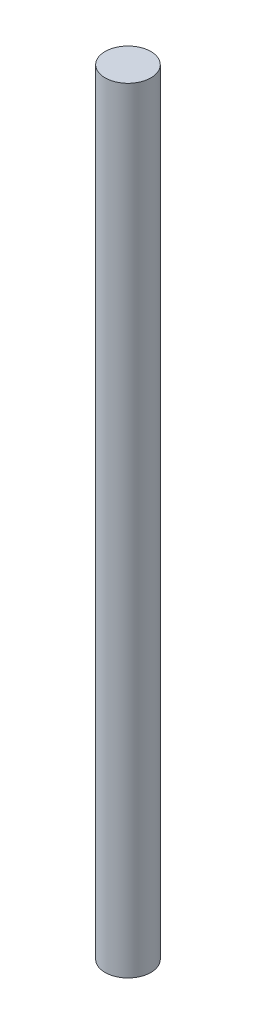
ISO-10303-21;
HEADER;
FILE_DESCRIPTION(('STEP AP214'),'2;1');
FILE_NAME('part.step','',(''),(''),'','','');
FILE_SCHEMA(('AUTOMOTIVE_DESIGN { 1 0 10303 214 1 1 1 1 }'));
ENDSEC;
DATA;
#1=APPLICATION_CONTEXT('core data for automotive mechanical design processes');
#2=APPLICATION_PROTOCOL_DEFINITION('international standard','automotive_design',2000,#1);
#3=PRODUCT_CONTEXT('',#1,'mechanical');
#4=PRODUCT('Part','Part','',(#3));
#5=PRODUCT_RELATED_PRODUCT_CATEGORY('part','',(#4));
#6=PRODUCT_DEFINITION_FORMATION('','',#4);
#7=PRODUCT_DEFINITION_CONTEXT('part definition',#1,'design');
#8=PRODUCT_DEFINITION('design','',#6,#7);
#9=PRODUCT_DEFINITION_SHAPE('','',#8);
#10=(LENGTH_UNIT() NAMED_UNIT(*) SI_UNIT(.MILLI.,.METRE.));
#11=(NAMED_UNIT(*) PLANE_ANGLE_UNIT() SI_UNIT($,.RADIAN.));
#12=(NAMED_UNIT(*) SI_UNIT($,.STERADIAN.) SOLID_ANGLE_UNIT());
#13=UNCERTAINTY_MEASURE_WITH_UNIT(LENGTH_MEASURE(1.E-05),#10,'distance_accuracy_value','');
#14=(GEOMETRIC_REPRESENTATION_CONTEXT(3) GLOBAL_UNCERTAINTY_ASSIGNED_CONTEXT((#13)) GLOBAL_UNIT_ASSIGNED_CONTEXT((#10,
#11,#12)) REPRESENTATION_CONTEXT('',''));
#15=CARTESIAN_POINT('',(0.,0.,0.));
#16=DIRECTION('',(0.,0.,1.));
#17=DIRECTION('',(1.,0.,0.));
#18=AXIS2_PLACEMENT_3D('',#15,#16,#17);
#19=CARTESIAN_POINT('',(0.,339.,0.));
#20=DIRECTION('',(0.,-1.,0.));
#21=DIRECTION('',(0.,0.,-1.));
#22=AXIS2_PLACEMENT_3D('',#19,#20,#21);
#23=CYLINDRICAL_SURFACE('',#22,10.);
#24=CARTESIAN_POINT('',(0.,339.,0.));
#25=DIRECTION('',(0.,1.,0.));
#26=DIRECTION('',(0.,0.,1.));
#27=AXIS2_PLACEMENT_3D('',#24,#25,#26);
#28=CIRCLE('',#27,10.);
#29=CARTESIAN_POINT('',(0.,339.,10.));
#30=VERTEX_POINT('',#29);
#31=EDGE_CURVE('E10',#30,#30,#28,.T.);
#32=ORIENTED_EDGE('',*,*,#31,.F.);
#33=EDGE_LOOP('',(#32));
#34=FACE_BOUND('',#33,.T.);
#35=CARTESIAN_POINT('',(0.,0.,0.));
#36=DIRECTION('',(0.,1.,0.));
#37=DIRECTION('',(0.,0.,1.));
#38=AXIS2_PLACEMENT_3D('',#35,#36,#37);
#39=CIRCLE('',#38,10.);
#40=CARTESIAN_POINT('',(0.,0.,10.));
#41=VERTEX_POINT('',#40);
#42=EDGE_CURVE('E34',#41,#41,#39,.T.);
#43=ORIENTED_EDGE('',*,*,#42,.T.);
#44=EDGE_LOOP('',(#43));
#45=FACE_BOUND('',#44,.T.);
#46=ADVANCED_FACE('F31',(#34,#45),#23,.T.);
#47=CARTESIAN_POINT('',(0.,339.,0.));
#48=DIRECTION('',(0.,1.,0.));
#49=DIRECTION('',(0.,0.,1.));
#50=AXIS2_PLACEMENT_3D('',#47,#48,#49);
#51=PLANE('',#50);
#52=ORIENTED_EDGE('',*,*,#31,.T.);
#53=EDGE_LOOP('',(#52));
#54=FACE_BOUND('',#53,.T.);
#55=ADVANCED_FACE('F46',(#54),#51,.T.);
#56=CARTESIAN_POINT('',(0.,0.,0.));
#57=DIRECTION('',(0.,1.,0.));
#58=DIRECTION('',(0.,0.,1.));
#59=AXIS2_PLACEMENT_3D('',#56,#57,#58);
#60=PLANE('',#59);
#61=ORIENTED_EDGE('',*,*,#42,.F.);
#62=EDGE_LOOP('',(#61));
#63=FACE_BOUND('',#62,.T.);
#64=ADVANCED_FACE('F44',(#63),#60,.F.);
#65=CLOSED_SHELL('',(#46,#55,#64));
#66=MANIFOLD_SOLID_BREP('B2',#65);
#67=ADVANCED_BREP_SHAPE_REPRESENTATION('',(#18,#66),#14);
#68=SHAPE_DEFINITION_REPRESENTATION(#9,#67);
ENDSEC;
END-ISO-10303-21;
